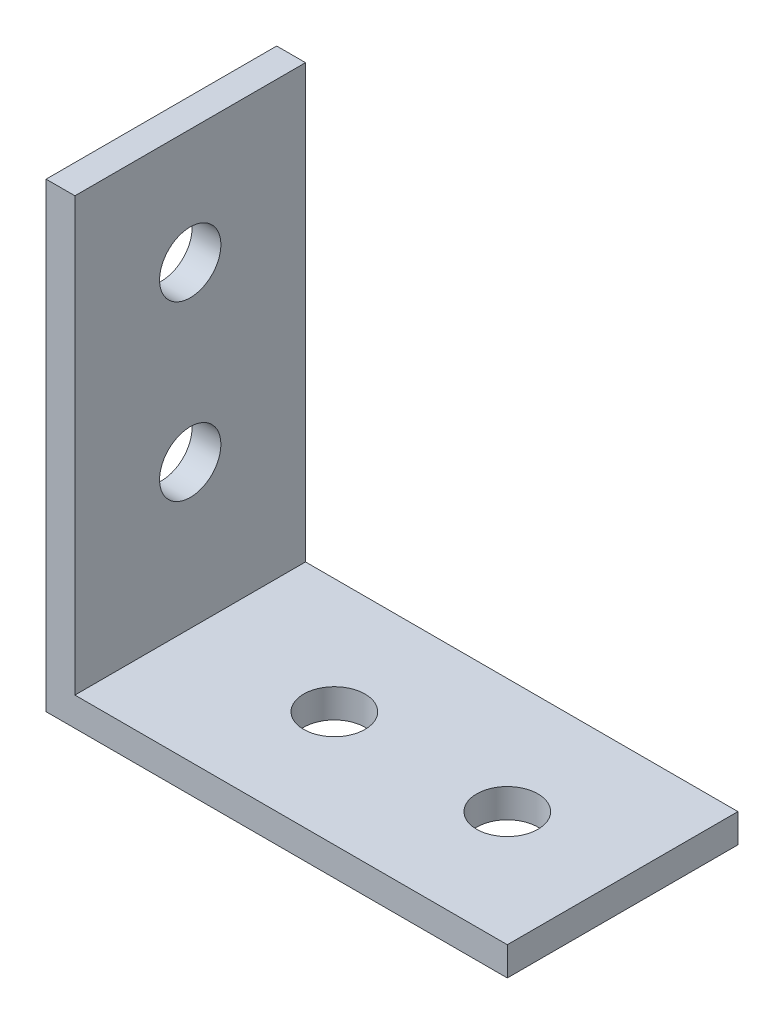
ISO-10303-21;
HEADER;
FILE_DESCRIPTION(('STEP AP214'),'2;1');
FILE_NAME('part.step','',(''),(''),'','','');
FILE_SCHEMA(('AUTOMOTIVE_DESIGN { 1 0 10303 214 1 1 1 1 }'));
ENDSEC;
DATA;
#1=APPLICATION_CONTEXT('core data for automotive mechanical design processes');
#2=APPLICATION_PROTOCOL_DEFINITION('international standard','automotive_design',2000,#1);
#3=PRODUCT_CONTEXT('',#1,'mechanical');
#4=PRODUCT('Part','Part','',(#3));
#5=PRODUCT_RELATED_PRODUCT_CATEGORY('part','',(#4));
#6=PRODUCT_DEFINITION_FORMATION('','',#4);
#7=PRODUCT_DEFINITION_CONTEXT('part definition',#1,'design');
#8=PRODUCT_DEFINITION('design','',#6,#7);
#9=PRODUCT_DEFINITION_SHAPE('','',#8);
#10=(LENGTH_UNIT() NAMED_UNIT(*) SI_UNIT(.MILLI.,.METRE.));
#11=(NAMED_UNIT(*) PLANE_ANGLE_UNIT() SI_UNIT($,.RADIAN.));
#12=(NAMED_UNIT(*) SI_UNIT($,.STERADIAN.) SOLID_ANGLE_UNIT());
#13=UNCERTAINTY_MEASURE_WITH_UNIT(LENGTH_MEASURE(1.E-05),#10,'distance_accuracy_value','');
#14=(GEOMETRIC_REPRESENTATION_CONTEXT(3) GLOBAL_UNCERTAINTY_ASSIGNED_CONTEXT((#13)) GLOBAL_UNIT_ASSIGNED_CONTEXT((#10,
#11,#12)) REPRESENTATION_CONTEXT('',''));
#15=CARTESIAN_POINT('',(0.,0.,0.));
#16=DIRECTION('',(0.,0.,1.));
#17=DIRECTION('',(1.,0.,0.));
#18=AXIS2_PLACEMENT_3D('',#15,#16,#17);
#19=CARTESIAN_POINT('',(3.175,-47.625,25.4));
#20=DIRECTION('',(0.,-1.,0.));
#21=DIRECTION('',(0.,0.,-1.));
#22=AXIS2_PLACEMENT_3D('',#19,#20,#21);
#23=PLANE('',#22);
#24=CARTESIAN_POINT('',(19.05,-47.625,12.7));
#25=DIRECTION('',(0.,1.,0.));
#26=DIRECTION('',(0.,0.,1.));
#27=AXIS2_PLACEMENT_3D('',#24,#25,#26);
#28=CIRCLE('',#27,3.3782);
#29=CARTESIAN_POINT('',(19.05,-47.625,16.0782));
#30=VERTEX_POINT('',#29);
#31=EDGE_CURVE('E192',#30,#30,#28,.T.);
#32=ORIENTED_EDGE('',*,*,#31,.F.);
#33=EDGE_LOOP('',(#32));
#34=FACE_BOUND('',#33,.T.);
#35=DIRECTION('',(-1.,0.,0.));
#36=VECTOR('',#35,1.);
#37=CARTESIAN_POINT('',(3.175,-47.625,0.));
#38=LINE('',#37,#36);
#39=CARTESIAN_POINT('',(50.8,-47.625,0.));
#40=VERTEX_POINT('',#39);
#41=CARTESIAN_POINT('',(3.175,-47.625,0.));
#42=VERTEX_POINT('',#41);
#43=EDGE_CURVE('E75',#40,#42,#38,.T.);
#44=ORIENTED_EDGE('',*,*,#43,.T.);
#45=DIRECTION('',(0.,0.,-1.));
#46=VECTOR('',#45,1.);
#47=CARTESIAN_POINT('',(3.175,-47.625,25.4));
#48=LINE('',#47,#46);
#49=CARTESIAN_POINT('',(3.175,-47.625,25.4));
#50=VERTEX_POINT('',#49);
#51=EDGE_CURVE('E112',#50,#42,#48,.T.);
#52=ORIENTED_EDGE('',*,*,#51,.F.);
#53=DIRECTION('',(-1.,0.,0.));
#54=VECTOR('',#53,1.);
#55=CARTESIAN_POINT('',(3.175,-47.625,25.4));
#56=LINE('',#55,#54);
#57=CARTESIAN_POINT('',(50.8,-47.625,25.4));
#58=VERTEX_POINT('',#57);
#59=EDGE_CURVE('E100',#58,#50,#56,.T.);
#60=ORIENTED_EDGE('',*,*,#59,.F.);
#61=DIRECTION('',(0.,0.,-1.));
#62=VECTOR('',#61,1.);
#63=CARTESIAN_POINT('',(50.8,-47.625,25.4));
#64=LINE('',#63,#62);
#65=EDGE_CURVE('E107',#58,#40,#64,.T.);
#66=ORIENTED_EDGE('',*,*,#65,.T.);
#67=EDGE_LOOP('',(#44,#52,#60,#66));
#68=FACE_BOUND('',#67,.T.);
#69=CARTESIAN_POINT('',(38.1,-47.625,12.7));
#70=DIRECTION('',(0.,1.,0.));
#71=DIRECTION('',(0.,0.,1.));
#72=AXIS2_PLACEMENT_3D('',#69,#70,#71);
#73=CIRCLE('',#72,3.3782);
#74=CARTESIAN_POINT('',(38.1,-47.625,16.0782));
#75=VERTEX_POINT('',#74);
#76=EDGE_CURVE('E180',#75,#75,#73,.T.);
#77=ORIENTED_EDGE('',*,*,#76,.F.);
#78=EDGE_LOOP('',(#77));
#79=FACE_BOUND('',#78,.T.);
#80=ADVANCED_FACE('F35',(#34,#68,#79),#23,.F.);
#81=CARTESIAN_POINT('',(0.,0.,25.4));
#82=DIRECTION('',(0.,-1.,0.));
#83=DIRECTION('',(0.,0.,-1.));
#84=AXIS2_PLACEMENT_3D('',#81,#82,#83);
#85=PLANE('',#84);
#86=DIRECTION('',(-1.,0.,0.));
#87=VECTOR('',#86,1.);
#88=CARTESIAN_POINT('',(0.,0.,0.));
#89=LINE('',#88,#87);
#90=CARTESIAN_POINT('',(3.175,0.,0.));
#91=VERTEX_POINT('',#90);
#92=CARTESIAN_POINT('',(0.,0.,0.));
#93=VERTEX_POINT('',#92);
#94=EDGE_CURVE('E120',#91,#93,#89,.T.);
#95=ORIENTED_EDGE('',*,*,#94,.T.);
#96=DIRECTION('',(0.,0.,-1.));
#97=VECTOR('',#96,1.);
#98=CARTESIAN_POINT('',(0.,0.,25.4));
#99=LINE('',#98,#97);
#100=CARTESIAN_POINT('',(0.,0.,25.4));
#101=VERTEX_POINT('',#100);
#102=EDGE_CURVE('E11',#101,#93,#99,.T.);
#103=ORIENTED_EDGE('',*,*,#102,.F.);
#104=DIRECTION('',(-1.,0.,0.));
#105=VECTOR('',#104,1.);
#106=CARTESIAN_POINT('',(0.,0.,25.4));
#107=LINE('',#106,#105);
#108=CARTESIAN_POINT('',(3.175,0.,25.4));
#109=VERTEX_POINT('',#108);
#110=EDGE_CURVE('E131',#109,#101,#107,.T.);
#111=ORIENTED_EDGE('',*,*,#110,.F.);
#112=DIRECTION('',(0.,0.,-1.));
#113=VECTOR('',#112,1.);
#114=CARTESIAN_POINT('',(3.175,0.,25.4));
#115=LINE('',#114,#113);
#116=EDGE_CURVE('E116',#109,#91,#115,.T.);
#117=ORIENTED_EDGE('',*,*,#116,.T.);
#118=EDGE_LOOP('',(#95,#103,#111,#117));
#119=FACE_BOUND('',#118,.T.);
#120=ADVANCED_FACE('F37',(#119),#85,.F.);
#121=CARTESIAN_POINT('',(0.,0.,25.4));
#122=DIRECTION('',(1.,0.,0.));
#123=DIRECTION('',(0.,1.,0.));
#124=AXIS2_PLACEMENT_3D('',#121,#122,#123);
#125=PLANE('',#124);
#126=CARTESIAN_POINT('',(0.,-12.7,12.7));
#127=DIRECTION('',(1.,0.,0.));
#128=DIRECTION('',(0.,1.,0.));
#129=AXIS2_PLACEMENT_3D('',#126,#127,#128);
#130=CIRCLE('',#129,3.3782);
#131=CARTESIAN_POINT('',(0.,-9.3218,12.7));
#132=VERTEX_POINT('',#131);
#133=EDGE_CURVE('E175',#132,#132,#130,.T.);
#134=ORIENTED_EDGE('',*,*,#133,.T.);
#135=EDGE_LOOP('',(#134));
#136=FACE_BOUND('',#135,.T.);
#137=CARTESIAN_POINT('',(0.,-31.75,12.7));
#138=DIRECTION('',(1.,0.,0.));
#139=DIRECTION('',(0.,1.,0.));
#140=AXIS2_PLACEMENT_3D('',#137,#138,#139);
#141=CIRCLE('',#140,3.3782);
#142=CARTESIAN_POINT('',(0.,-28.3718,12.7));
#143=VERTEX_POINT('',#142);
#144=EDGE_CURVE('E178',#143,#143,#141,.T.);
#145=ORIENTED_EDGE('',*,*,#144,.T.);
#146=EDGE_LOOP('',(#145));
#147=FACE_BOUND('',#146,.T.);
#148=DIRECTION('',(0.,-1.,0.));
#149=VECTOR('',#148,1.);
#150=CARTESIAN_POINT('',(0.,0.,0.));
#151=LINE('',#150,#149);
#152=CARTESIAN_POINT('',(0.,-50.8,0.));
#153=VERTEX_POINT('',#152);
#154=EDGE_CURVE('E123',#93,#153,#151,.T.);
#155=ORIENTED_EDGE('',*,*,#154,.T.);
#156=DIRECTION('',(0.,0.,-1.));
#157=VECTOR('',#156,1.);
#158=CARTESIAN_POINT('',(0.,-50.8,25.4));
#159=LINE('',#158,#157);
#160=CARTESIAN_POINT('',(0.,-50.8,25.4));
#161=VERTEX_POINT('',#160);
#162=EDGE_CURVE('E44',#161,#153,#159,.T.);
#163=ORIENTED_EDGE('',*,*,#162,.F.);
#164=DIRECTION('',(0.,-1.,0.));
#165=VECTOR('',#164,1.);
#166=CARTESIAN_POINT('',(0.,0.,25.4));
#167=LINE('',#166,#165);
#168=EDGE_CURVE('E89',#101,#161,#167,.T.);
#169=ORIENTED_EDGE('',*,*,#168,.F.);
#170=ORIENTED_EDGE('',*,*,#102,.T.);
#171=EDGE_LOOP('',(#155,#163,#169,#170));
#172=FACE_BOUND('',#171,.T.);
#173=ADVANCED_FACE('F163',(#136,#147,#172),#125,.F.);
#174=CARTESIAN_POINT('',(0.,-50.8,25.4));
#175=DIRECTION('',(0.,1.,0.));
#176=DIRECTION('',(0.,0.,1.));
#177=AXIS2_PLACEMENT_3D('',#174,#175,#176);
#178=PLANE('',#177);
#179=CARTESIAN_POINT('',(38.1,-50.8,12.7));
#180=DIRECTION('',(0.,1.,0.));
#181=DIRECTION('',(0.,0.,1.));
#182=AXIS2_PLACEMENT_3D('',#179,#180,#181);
#183=CIRCLE('',#182,3.3782);
#184=CARTESIAN_POINT('',(38.1,-50.8,16.0782));
#185=VERTEX_POINT('',#184);
#186=EDGE_CURVE('E184',#185,#185,#183,.T.);
#187=ORIENTED_EDGE('',*,*,#186,.T.);
#188=EDGE_LOOP('',(#187));
#189=FACE_BOUND('',#188,.T.);
#190=CARTESIAN_POINT('',(19.05,-50.8,12.7));
#191=DIRECTION('',(0.,1.,0.));
#192=DIRECTION('',(0.,0.,1.));
#193=AXIS2_PLACEMENT_3D('',#190,#191,#192);
#194=CIRCLE('',#193,3.3782);
#195=CARTESIAN_POINT('',(19.05,-50.8,16.0782));
#196=VERTEX_POINT('',#195);
#197=EDGE_CURVE('E124',#196,#196,#194,.T.);
#198=ORIENTED_EDGE('',*,*,#197,.T.);
#199=EDGE_LOOP('',(#198));
#200=FACE_BOUND('',#199,.T.);
#201=DIRECTION('',(1.,0.,0.));
#202=VECTOR('',#201,1.);
#203=CARTESIAN_POINT('',(0.,-50.8,0.));
#204=LINE('',#203,#202);
#205=CARTESIAN_POINT('',(50.8,-50.8,0.));
#206=VERTEX_POINT('',#205);
#207=EDGE_CURVE('E126',#153,#206,#204,.T.);
#208=ORIENTED_EDGE('',*,*,#207,.T.);
#209=DIRECTION('',(0.,0.,-1.));
#210=VECTOR('',#209,1.);
#211=CARTESIAN_POINT('',(50.8,-50.8,25.4));
#212=LINE('',#211,#210);
#213=CARTESIAN_POINT('',(50.8,-50.8,25.4));
#214=VERTEX_POINT('',#213);
#215=EDGE_CURVE('E111',#214,#206,#212,.T.);
#216=ORIENTED_EDGE('',*,*,#215,.F.);
#217=DIRECTION('',(1.,0.,0.));
#218=VECTOR('',#217,1.);
#219=CARTESIAN_POINT('',(0.,-50.8,25.4));
#220=LINE('',#219,#218);
#221=EDGE_CURVE('E102',#161,#214,#220,.T.);
#222=ORIENTED_EDGE('',*,*,#221,.F.);
#223=ORIENTED_EDGE('',*,*,#162,.T.);
#224=EDGE_LOOP('',(#208,#216,#222,#223));
#225=FACE_BOUND('',#224,.T.);
#226=ADVANCED_FACE('F137',(#189,#200,#225),#178,.F.);
#227=CARTESIAN_POINT('',(50.8,-50.8,25.4));
#228=DIRECTION('',(-1.,0.,0.));
#229=DIRECTION('',(0.,0.,1.));
#230=AXIS2_PLACEMENT_3D('',#227,#228,#229);
#231=PLANE('',#230);
#232=DIRECTION('',(0.,1.,0.));
#233=VECTOR('',#232,1.);
#234=CARTESIAN_POINT('',(50.8,-50.8,0.));
#235=LINE('',#234,#233);
#236=EDGE_CURVE('E110',#206,#40,#235,.T.);
#237=ORIENTED_EDGE('',*,*,#236,.T.);
#238=ORIENTED_EDGE('',*,*,#65,.F.);
#239=DIRECTION('',(0.,1.,0.));
#240=VECTOR('',#239,1.);
#241=CARTESIAN_POINT('',(50.8,-50.8,25.4));
#242=LINE('',#241,#240);
#243=EDGE_CURVE('E96',#214,#58,#242,.T.);
#244=ORIENTED_EDGE('',*,*,#243,.F.);
#245=ORIENTED_EDGE('',*,*,#215,.T.);
#246=EDGE_LOOP('',(#237,#238,#244,#245));
#247=FACE_BOUND('',#246,.T.);
#248=ADVANCED_FACE('F108',(#247),#231,.F.);
#249=CARTESIAN_POINT('',(3.175,0.,25.4));
#250=DIRECTION('',(-1.,0.,0.));
#251=DIRECTION('',(0.,-1.,0.));
#252=AXIS2_PLACEMENT_3D('',#249,#250,#251);
#253=PLANE('',#252);
#254=CARTESIAN_POINT('',(3.175,-12.7,12.7));
#255=DIRECTION('',(1.,0.,0.));
#256=DIRECTION('',(0.,0.,-1.));
#257=AXIS2_PLACEMENT_3D('',#254,#255,#256);
#258=CIRCLE('',#257,3.3782);
#259=CARTESIAN_POINT('',(3.175,-12.7,9.3218));
#260=VERTEX_POINT('',#259);
#261=EDGE_CURVE('E223',#260,#260,#258,.T.);
#262=ORIENTED_EDGE('',*,*,#261,.F.);
#263=EDGE_LOOP('',(#262));
#264=FACE_BOUND('',#263,.T.);
#265=CARTESIAN_POINT('',(3.175,-31.75,12.7));
#266=DIRECTION('',(1.,0.,0.));
#267=DIRECTION('',(0.,0.,-1.));
#268=AXIS2_PLACEMENT_3D('',#265,#266,#267);
#269=CIRCLE('',#268,3.3782);
#270=CARTESIAN_POINT('',(3.175,-31.75,9.3218));
#271=VERTEX_POINT('',#270);
#272=EDGE_CURVE('E181',#271,#271,#269,.T.);
#273=ORIENTED_EDGE('',*,*,#272,.F.);
#274=EDGE_LOOP('',(#273));
#275=FACE_BOUND('',#274,.T.);
#276=DIRECTION('',(0.,1.,0.));
#277=VECTOR('',#276,1.);
#278=CARTESIAN_POINT('',(3.175,0.,0.));
#279=LINE('',#278,#277);
#280=EDGE_CURVE('E81',#42,#91,#279,.T.);
#281=ORIENTED_EDGE('',*,*,#280,.T.);
#282=ORIENTED_EDGE('',*,*,#116,.F.);
#283=DIRECTION('',(0.,1.,0.));
#284=VECTOR('',#283,1.);
#285=CARTESIAN_POINT('',(3.175,0.,25.4));
#286=LINE('',#285,#284);
#287=EDGE_CURVE('E52',#50,#109,#286,.T.);
#288=ORIENTED_EDGE('',*,*,#287,.F.);
#289=ORIENTED_EDGE('',*,*,#51,.T.);
#290=EDGE_LOOP('',(#281,#282,#288,#289));
#291=FACE_BOUND('',#290,.T.);
#292=ADVANCED_FACE('F144',(#264,#275,#291),#253,.F.);
#293=CARTESIAN_POINT('',(0.,0.,25.4));
#294=DIRECTION('',(0.,0.,-1.));
#295=DIRECTION('',(-1.,0.,0.));
#296=AXIS2_PLACEMENT_3D('',#293,#294,#295);
#297=PLANE('',#296);
#298=ORIENTED_EDGE('',*,*,#110,.T.);
#299=ORIENTED_EDGE('',*,*,#168,.T.);
#300=ORIENTED_EDGE('',*,*,#221,.T.);
#301=ORIENTED_EDGE('',*,*,#243,.T.);
#302=ORIENTED_EDGE('',*,*,#59,.T.);
#303=ORIENTED_EDGE('',*,*,#287,.T.);
#304=EDGE_LOOP('',(#298,#299,#300,#301,#302,#303));
#305=FACE_BOUND('',#304,.T.);
#306=ADVANCED_FACE('F98',(#305),#297,.F.);
#307=CARTESIAN_POINT('',(0.,0.,0.));
#308=DIRECTION('',(0.,0.,-1.));
#309=DIRECTION('',(-1.,0.,0.));
#310=AXIS2_PLACEMENT_3D('',#307,#308,#309);
#311=PLANE('',#310);
#312=ORIENTED_EDGE('',*,*,#94,.F.);
#313=ORIENTED_EDGE('',*,*,#280,.F.);
#314=ORIENTED_EDGE('',*,*,#43,.F.);
#315=ORIENTED_EDGE('',*,*,#236,.F.);
#316=ORIENTED_EDGE('',*,*,#207,.F.);
#317=ORIENTED_EDGE('',*,*,#154,.F.);
#318=EDGE_LOOP('',(#312,#313,#314,#315,#316,#317));
#319=FACE_BOUND('',#318,.T.);
#320=ADVANCED_FACE('F140',(#319),#311,.T.);
#321=CARTESIAN_POINT('',(19.05,-47.625,12.7));
#322=DIRECTION('',(0.,1.,0.));
#323=DIRECTION('',(0.,0.,1.));
#324=AXIS2_PLACEMENT_3D('',#321,#322,#323);
#325=CYLINDRICAL_SURFACE('',#324,3.3782);
#326=ORIENTED_EDGE('',*,*,#197,.F.);
#327=EDGE_LOOP('',(#326));
#328=FACE_BOUND('',#327,.T.);
#329=ORIENTED_EDGE('',*,*,#31,.T.);
#330=EDGE_LOOP('',(#329));
#331=FACE_BOUND('',#330,.T.);
#332=ADVANCED_FACE('F201',(#328,#331),#325,.F.);
#333=CARTESIAN_POINT('',(38.1,-47.625,12.7));
#334=DIRECTION('',(0.,1.,0.));
#335=DIRECTION('',(0.,0.,1.));
#336=AXIS2_PLACEMENT_3D('',#333,#334,#335);
#337=CYLINDRICAL_SURFACE('',#336,3.3782);
#338=ORIENTED_EDGE('',*,*,#186,.F.);
#339=EDGE_LOOP('',(#338));
#340=FACE_BOUND('',#339,.T.);
#341=ORIENTED_EDGE('',*,*,#76,.T.);
#342=EDGE_LOOP('',(#341));
#343=FACE_BOUND('',#342,.T.);
#344=ADVANCED_FACE('F204',(#340,#343),#337,.F.);
#345=CARTESIAN_POINT('',(3.175,-31.75,12.7));
#346=DIRECTION('',(1.,0.,0.));
#347=DIRECTION('',(0.,0.,-1.));
#348=AXIS2_PLACEMENT_3D('',#345,#346,#347);
#349=CYLINDRICAL_SURFACE('',#348,3.3782);
#350=ORIENTED_EDGE('',*,*,#144,.F.);
#351=EDGE_LOOP('',(#350));
#352=FACE_BOUND('',#351,.T.);
#353=ORIENTED_EDGE('',*,*,#272,.T.);
#354=EDGE_LOOP('',(#353));
#355=FACE_BOUND('',#354,.T.);
#356=ADVANCED_FACE('F210',(#352,#355),#349,.F.);
#357=CARTESIAN_POINT('',(3.175,-12.7,12.7));
#358=DIRECTION('',(1.,0.,0.));
#359=DIRECTION('',(0.,0.,-1.));
#360=AXIS2_PLACEMENT_3D('',#357,#358,#359);
#361=CYLINDRICAL_SURFACE('',#360,3.3782);
#362=ORIENTED_EDGE('',*,*,#133,.F.);
#363=EDGE_LOOP('',(#362));
#364=FACE_BOUND('',#363,.T.);
#365=ORIENTED_EDGE('',*,*,#261,.T.);
#366=EDGE_LOOP('',(#365));
#367=FACE_BOUND('',#366,.T.);
#368=ADVANCED_FACE('F216',(#364,#367),#361,.F.);
#369=CLOSED_SHELL('',(#80,#120,#173,#226,#248,#292,#306,#320,#332,#344,#356,#368));
#370=MANIFOLD_SOLID_BREP('B2',#369);
#371=ADVANCED_BREP_SHAPE_REPRESENTATION('',(#18,#370),#14);
#372=SHAPE_DEFINITION_REPRESENTATION(#9,#371);
ENDSEC;
END-ISO-10303-21;
